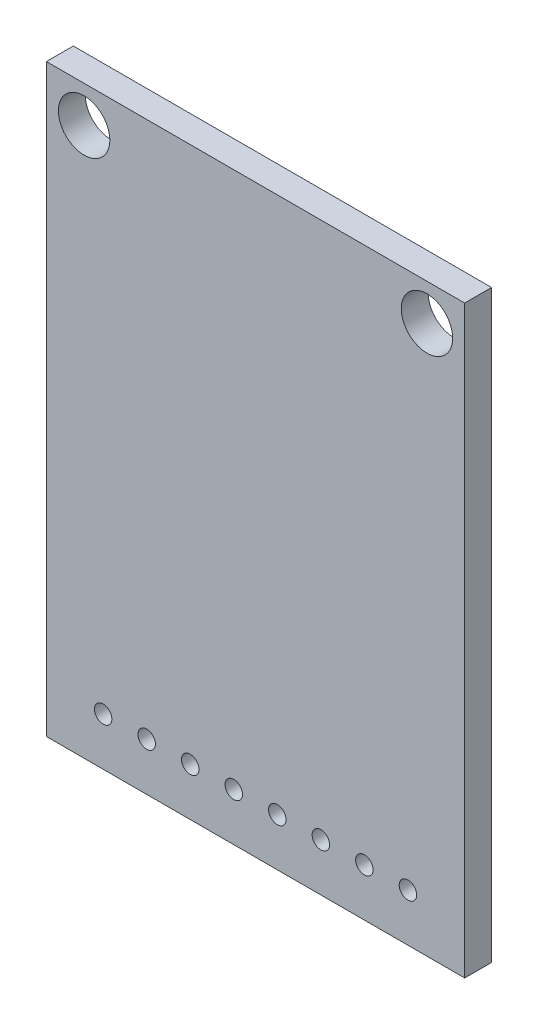
ISO-10303-21;
HEADER;
FILE_DESCRIPTION(('STEP AP214'),'2;1');
FILE_NAME('part.step','',(''),(''),'','','');
FILE_SCHEMA(('AUTOMOTIVE_DESIGN { 1 0 10303 214 1 1 1 1 }'));
ENDSEC;
DATA;
#1=APPLICATION_CONTEXT('core data for automotive mechanical design processes');
#2=APPLICATION_PROTOCOL_DEFINITION('international standard','automotive_design',2000,#1);
#3=PRODUCT_CONTEXT('',#1,'mechanical');
#4=PRODUCT('Part','Part','',(#3));
#5=PRODUCT_RELATED_PRODUCT_CATEGORY('part','',(#4));
#6=PRODUCT_DEFINITION_FORMATION('','',#4);
#7=PRODUCT_DEFINITION_CONTEXT('part definition',#1,'design');
#8=PRODUCT_DEFINITION('design','',#6,#7);
#9=PRODUCT_DEFINITION_SHAPE('','',#8);
#10=(LENGTH_UNIT() NAMED_UNIT(*) SI_UNIT(.MILLI.,.METRE.));
#11=(NAMED_UNIT(*) PLANE_ANGLE_UNIT() SI_UNIT($,.RADIAN.));
#12=(NAMED_UNIT(*) SI_UNIT($,.STERADIAN.) SOLID_ANGLE_UNIT());
#13=UNCERTAINTY_MEASURE_WITH_UNIT(LENGTH_MEASURE(1.E-05),#10,'distance_accuracy_value','');
#14=(GEOMETRIC_REPRESENTATION_CONTEXT(3) GLOBAL_UNCERTAINTY_ASSIGNED_CONTEXT((#13)) GLOBAL_UNIT_ASSIGNED_CONTEXT((#10,
#11,#12)) REPRESENTATION_CONTEXT('',''));
#15=CARTESIAN_POINT('',(0.,0.,0.));
#16=DIRECTION('',(0.,0.,1.));
#17=DIRECTION('',(1.,0.,0.));
#18=AXIS2_PLACEMENT_3D('',#15,#16,#17);
#19=CARTESIAN_POINT('',(0.,0.,1.57));
#20=DIRECTION('',(0.,0.,1.));
#21=DIRECTION('',(1.,0.,0.));
#22=AXIS2_PLACEMENT_3D('',#19,#20,#21);
#23=PLANE('',#22);
#24=CARTESIAN_POINT('',(6.35,-14.26,1.57));
#25=DIRECTION('',(0.,0.,1.));
#26=DIRECTION('',(1.,0.,0.));
#27=AXIS2_PLACEMENT_3D('',#24,#25,#26);
#28=CIRCLE('',#27,0.51);
#29=CARTESIAN_POINT('',(6.86,-14.26,1.57));
#30=VERTEX_POINT('',#29);
#31=EDGE_CURVE('E190',#30,#30,#28,.T.);
#32=ORIENTED_EDGE('',*,*,#31,.F.);
#33=EDGE_LOOP('',(#32));
#34=FACE_BOUND('',#33,.T.);
#35=CARTESIAN_POINT('',(1.27,-14.26,1.57));
#36=DIRECTION('',(0.,0.,1.));
#37=DIRECTION('',(1.,0.,0.));
#38=AXIS2_PLACEMENT_3D('',#35,#36,#37);
#39=CIRCLE('',#38,0.51);
#40=CARTESIAN_POINT('',(1.78,-14.26,1.57));
#41=VERTEX_POINT('',#40);
#42=EDGE_CURVE('E174',#41,#41,#39,.T.);
#43=ORIENTED_EDGE('',*,*,#42,.F.);
#44=EDGE_LOOP('',(#43));
#45=FACE_BOUND('',#44,.T.);
#46=CARTESIAN_POINT('',(-3.81,-14.26,1.57));
#47=DIRECTION('',(0.,0.,1.));
#48=DIRECTION('',(1.,0.,0.));
#49=AXIS2_PLACEMENT_3D('',#46,#47,#48);
#50=CIRCLE('',#49,0.51);
#51=CARTESIAN_POINT('',(-3.3,-14.26,1.57));
#52=VERTEX_POINT('',#51);
#53=EDGE_CURVE('E158',#52,#52,#50,.T.);
#54=ORIENTED_EDGE('',*,*,#53,.F.);
#55=EDGE_LOOP('',(#54));
#56=FACE_BOUND('',#55,.T.);
#57=CARTESIAN_POINT('',(-8.89,-14.26,1.57));
#58=DIRECTION('',(0.,0.,1.));
#59=DIRECTION('',(1.,0.,0.));
#60=AXIS2_PLACEMENT_3D('',#57,#58,#59);
#61=CIRCLE('',#60,0.510000000000001);
#62=CARTESIAN_POINT('',(-8.38,-14.26,1.57));
#63=VERTEX_POINT('',#62);
#64=EDGE_CURVE('E142',#63,#63,#61,.T.);
#65=ORIENTED_EDGE('',*,*,#64,.F.);
#66=EDGE_LOOP('',(#65));
#67=FACE_BOUND('',#66,.T.);
#68=CARTESIAN_POINT('',(-10.,14.92,1.57));
#69=DIRECTION('',(0.,0.,1.));
#70=DIRECTION('',(1.,0.,0.));
#71=AXIS2_PLACEMENT_3D('',#68,#69,#70);
#72=CIRCLE('',#71,1.5);
#73=CARTESIAN_POINT('',(-8.5,14.92,1.57));
#74=VERTEX_POINT('',#73);
#75=EDGE_CURVE('E112',#74,#74,#72,.T.);
#76=ORIENTED_EDGE('',*,*,#75,.F.);
#77=EDGE_LOOP('',(#76));
#78=FACE_BOUND('',#77,.T.);
#79=DIRECTION('',(0.,1.,0.));
#80=VECTOR('',#79,1.);
#81=CARTESIAN_POINT('',(12.2,17.05,1.57));
#82=LINE('',#81,#80);
#83=CARTESIAN_POINT('',(12.2,-17.05,1.57));
#84=VERTEX_POINT('',#83);
#85=CARTESIAN_POINT('',(12.2,17.05,1.57));
#86=VERTEX_POINT('',#85);
#87=EDGE_CURVE('E92',#84,#86,#82,.T.);
#88=ORIENTED_EDGE('',*,*,#87,.T.);
#89=DIRECTION('',(-1.,0.,0.));
#90=VECTOR('',#89,1.);
#91=CARTESIAN_POINT('',(-12.2,17.05,1.57));
#92=LINE('',#91,#90);
#93=CARTESIAN_POINT('',(-12.2,17.05,1.57));
#94=VERTEX_POINT('',#93);
#95=EDGE_CURVE('E87',#86,#94,#92,.T.);
#96=ORIENTED_EDGE('',*,*,#95,.T.);
#97=DIRECTION('',(0.,-1.,0.));
#98=VECTOR('',#97,1.);
#99=CARTESIAN_POINT('',(-12.2,17.05,1.57));
#100=LINE('',#99,#98);
#101=CARTESIAN_POINT('',(-12.2,-17.05,1.57));
#102=VERTEX_POINT('',#101);
#103=EDGE_CURVE('E90',#94,#102,#100,.T.);
#104=ORIENTED_EDGE('',*,*,#103,.T.);
#105=DIRECTION('',(1.,0.,0.));
#106=VECTOR('',#105,1.);
#107=CARTESIAN_POINT('',(-12.2,-17.05,1.57));
#108=LINE('',#107,#106);
#109=EDGE_CURVE('E57',#102,#84,#108,.T.);
#110=ORIENTED_EDGE('',*,*,#109,.T.);
#111=EDGE_LOOP('',(#88,#96,#104,#110));
#112=FACE_BOUND('',#111,.T.);
#113=CARTESIAN_POINT('',(10.,14.92,1.57));
#114=DIRECTION('',(0.,0.,1.));
#115=DIRECTION('',(1.,0.,0.));
#116=AXIS2_PLACEMENT_3D('',#113,#114,#115);
#117=CIRCLE('',#116,1.5);
#118=CARTESIAN_POINT('',(11.5,14.92,1.57));
#119=VERTEX_POINT('',#118);
#120=EDGE_CURVE('E134',#119,#119,#117,.T.);
#121=ORIENTED_EDGE('',*,*,#120,.F.);
#122=EDGE_LOOP('',(#121));
#123=FACE_BOUND('',#122,.T.);
#124=CARTESIAN_POINT('',(-6.35,-14.26,1.57));
#125=DIRECTION('',(0.,0.,1.));
#126=DIRECTION('',(1.,0.,0.));
#127=AXIS2_PLACEMENT_3D('',#124,#125,#126);
#128=CIRCLE('',#127,0.509999999999999);
#129=CARTESIAN_POINT('',(-5.84,-14.26,1.57));
#130=VERTEX_POINT('',#129);
#131=EDGE_CURVE('E150',#130,#130,#128,.T.);
#132=ORIENTED_EDGE('',*,*,#131,.F.);
#133=EDGE_LOOP('',(#132));
#134=FACE_BOUND('',#133,.T.);
#135=CARTESIAN_POINT('',(-1.27,-14.26,1.57));
#136=DIRECTION('',(0.,0.,1.));
#137=DIRECTION('',(1.,0.,0.));
#138=AXIS2_PLACEMENT_3D('',#135,#136,#137);
#139=CIRCLE('',#138,0.510000000000001);
#140=CARTESIAN_POINT('',(-0.76,-14.26,1.57));
#141=VERTEX_POINT('',#140);
#142=EDGE_CURVE('E166',#141,#141,#139,.T.);
#143=ORIENTED_EDGE('',*,*,#142,.F.);
#144=EDGE_LOOP('',(#143));
#145=FACE_BOUND('',#144,.T.);
#146=CARTESIAN_POINT('',(3.81,-14.26,1.57));
#147=DIRECTION('',(0.,0.,1.));
#148=DIRECTION('',(1.,0.,0.));
#149=AXIS2_PLACEMENT_3D('',#146,#147,#148);
#150=CIRCLE('',#149,0.51);
#151=CARTESIAN_POINT('',(4.32,-14.26,1.57));
#152=VERTEX_POINT('',#151);
#153=EDGE_CURVE('E182',#152,#152,#150,.T.);
#154=ORIENTED_EDGE('',*,*,#153,.F.);
#155=EDGE_LOOP('',(#154));
#156=FACE_BOUND('',#155,.T.);
#157=CARTESIAN_POINT('',(8.89,-14.26,1.57));
#158=DIRECTION('',(0.,0.,1.));
#159=DIRECTION('',(1.,0.,0.));
#160=AXIS2_PLACEMENT_3D('',#157,#158,#159);
#161=CIRCLE('',#160,0.510000000000001);
#162=CARTESIAN_POINT('',(9.4,-14.26,1.57));
#163=VERTEX_POINT('',#162);
#164=EDGE_CURVE('E198',#163,#163,#161,.T.);
#165=ORIENTED_EDGE('',*,*,#164,.F.);
#166=EDGE_LOOP('',(#165));
#167=FACE_BOUND('',#166,.T.);
#168=ADVANCED_FACE('F39',(#34,#45,#56,#67,#78,#112,#123,#134,#145,#156,#167),#23,.T.);
#169=CARTESIAN_POINT('',(0.,0.,0.));
#170=DIRECTION('',(0.,0.,1.));
#171=DIRECTION('',(1.,0.,0.));
#172=AXIS2_PLACEMENT_3D('',#169,#170,#171);
#173=PLANE('',#172);
#174=DIRECTION('',(0.,1.,0.));
#175=VECTOR('',#174,1.);
#176=CARTESIAN_POINT('',(12.2,17.05,0.));
#177=LINE('',#176,#175);
#178=CARTESIAN_POINT('',(12.2,-17.05,0.));
#179=VERTEX_POINT('',#178);
#180=CARTESIAN_POINT('',(12.2,17.05,0.));
#181=VERTEX_POINT('',#180);
#182=EDGE_CURVE('E108',#179,#181,#177,.T.);
#183=ORIENTED_EDGE('',*,*,#182,.F.);
#184=DIRECTION('',(1.,0.,0.));
#185=VECTOR('',#184,1.);
#186=CARTESIAN_POINT('',(-12.2,-17.05,0.));
#187=LINE('',#186,#185);
#188=CARTESIAN_POINT('',(-12.2,-17.05,0.));
#189=VERTEX_POINT('',#188);
#190=EDGE_CURVE('E80',#189,#179,#187,.T.);
#191=ORIENTED_EDGE('',*,*,#190,.F.);
#192=DIRECTION('',(0.,-1.,0.));
#193=VECTOR('',#192,1.);
#194=CARTESIAN_POINT('',(-12.2,17.05,0.));
#195=LINE('',#194,#193);
#196=CARTESIAN_POINT('',(-12.2,17.05,0.));
#197=VERTEX_POINT('',#196);
#198=EDGE_CURVE('E74',#197,#189,#195,.T.);
#199=ORIENTED_EDGE('',*,*,#198,.F.);
#200=DIRECTION('',(-1.,0.,0.));
#201=VECTOR('',#200,1.);
#202=CARTESIAN_POINT('',(-12.2,17.05,0.));
#203=LINE('',#202,#201);
#204=EDGE_CURVE('E97',#181,#197,#203,.T.);
#205=ORIENTED_EDGE('',*,*,#204,.F.);
#206=EDGE_LOOP('',(#183,#191,#199,#205));
#207=FACE_BOUND('',#206,.T.);
#208=CARTESIAN_POINT('',(-10.,14.92,0.));
#209=DIRECTION('',(0.,0.,1.));
#210=DIRECTION('',(1.,0.,0.));
#211=AXIS2_PLACEMENT_3D('',#208,#209,#210);
#212=CIRCLE('',#211,1.5);
#213=CARTESIAN_POINT('',(-8.5,14.92,0.));
#214=VERTEX_POINT('',#213);
#215=EDGE_CURVE('E130',#214,#214,#212,.T.);
#216=ORIENTED_EDGE('',*,*,#215,.T.);
#217=EDGE_LOOP('',(#216));
#218=FACE_BOUND('',#217,.T.);
#219=CARTESIAN_POINT('',(10.,14.92,0.));
#220=DIRECTION('',(0.,0.,1.));
#221=DIRECTION('',(1.,0.,0.));
#222=AXIS2_PLACEMENT_3D('',#219,#220,#221);
#223=CIRCLE('',#222,1.5);
#224=CARTESIAN_POINT('',(11.5,14.92,0.));
#225=VERTEX_POINT('',#224);
#226=EDGE_CURVE('E138',#225,#225,#223,.T.);
#227=ORIENTED_EDGE('',*,*,#226,.T.);
#228=EDGE_LOOP('',(#227));
#229=FACE_BOUND('',#228,.T.);
#230=CARTESIAN_POINT('',(-8.89,-14.26,0.));
#231=DIRECTION('',(0.,0.,1.));
#232=DIRECTION('',(1.,0.,0.));
#233=AXIS2_PLACEMENT_3D('',#230,#231,#232);
#234=CIRCLE('',#233,0.510000000000001);
#235=CARTESIAN_POINT('',(-8.38,-14.26,0.));
#236=VERTEX_POINT('',#235);
#237=EDGE_CURVE('E146',#236,#236,#234,.T.);
#238=ORIENTED_EDGE('',*,*,#237,.T.);
#239=EDGE_LOOP('',(#238));
#240=FACE_BOUND('',#239,.T.);
#241=CARTESIAN_POINT('',(-6.35,-14.26,0.));
#242=DIRECTION('',(0.,0.,1.));
#243=DIRECTION('',(1.,0.,0.));
#244=AXIS2_PLACEMENT_3D('',#241,#242,#243);
#245=CIRCLE('',#244,0.509999999999999);
#246=CARTESIAN_POINT('',(-5.84,-14.26,0.));
#247=VERTEX_POINT('',#246);
#248=EDGE_CURVE('E154',#247,#247,#245,.T.);
#249=ORIENTED_EDGE('',*,*,#248,.T.);
#250=EDGE_LOOP('',(#249));
#251=FACE_BOUND('',#250,.T.);
#252=CARTESIAN_POINT('',(-3.81,-14.26,0.));
#253=DIRECTION('',(0.,0.,1.));
#254=DIRECTION('',(1.,0.,0.));
#255=AXIS2_PLACEMENT_3D('',#252,#253,#254);
#256=CIRCLE('',#255,0.51);
#257=CARTESIAN_POINT('',(-3.3,-14.26,0.));
#258=VERTEX_POINT('',#257);
#259=EDGE_CURVE('E162',#258,#258,#256,.T.);
#260=ORIENTED_EDGE('',*,*,#259,.T.);
#261=EDGE_LOOP('',(#260));
#262=FACE_BOUND('',#261,.T.);
#263=CARTESIAN_POINT('',(-1.27,-14.26,0.));
#264=DIRECTION('',(0.,0.,1.));
#265=DIRECTION('',(1.,0.,0.));
#266=AXIS2_PLACEMENT_3D('',#263,#264,#265);
#267=CIRCLE('',#266,0.510000000000001);
#268=CARTESIAN_POINT('',(-0.76,-14.26,0.));
#269=VERTEX_POINT('',#268);
#270=EDGE_CURVE('E170',#269,#269,#267,.T.);
#271=ORIENTED_EDGE('',*,*,#270,.T.);
#272=EDGE_LOOP('',(#271));
#273=FACE_BOUND('',#272,.T.);
#274=CARTESIAN_POINT('',(1.27,-14.26,0.));
#275=DIRECTION('',(0.,0.,1.));
#276=DIRECTION('',(1.,0.,0.));
#277=AXIS2_PLACEMENT_3D('',#274,#275,#276);
#278=CIRCLE('',#277,0.51);
#279=CARTESIAN_POINT('',(1.78,-14.26,0.));
#280=VERTEX_POINT('',#279);
#281=EDGE_CURVE('E178',#280,#280,#278,.T.);
#282=ORIENTED_EDGE('',*,*,#281,.T.);
#283=EDGE_LOOP('',(#282));
#284=FACE_BOUND('',#283,.T.);
#285=CARTESIAN_POINT('',(3.81,-14.26,0.));
#286=DIRECTION('',(0.,0.,1.));
#287=DIRECTION('',(1.,0.,0.));
#288=AXIS2_PLACEMENT_3D('',#285,#286,#287);
#289=CIRCLE('',#288,0.51);
#290=CARTESIAN_POINT('',(4.32,-14.26,0.));
#291=VERTEX_POINT('',#290);
#292=EDGE_CURVE('E186',#291,#291,#289,.T.);
#293=ORIENTED_EDGE('',*,*,#292,.T.);
#294=EDGE_LOOP('',(#293));
#295=FACE_BOUND('',#294,.T.);
#296=CARTESIAN_POINT('',(6.35,-14.26,0.));
#297=DIRECTION('',(0.,0.,1.));
#298=DIRECTION('',(1.,0.,0.));
#299=AXIS2_PLACEMENT_3D('',#296,#297,#298);
#300=CIRCLE('',#299,0.51);
#301=CARTESIAN_POINT('',(6.86,-14.26,0.));
#302=VERTEX_POINT('',#301);
#303=EDGE_CURVE('E194',#302,#302,#300,.T.);
#304=ORIENTED_EDGE('',*,*,#303,.T.);
#305=EDGE_LOOP('',(#304));
#306=FACE_BOUND('',#305,.T.);
#307=CARTESIAN_POINT('',(8.89,-14.26,0.));
#308=DIRECTION('',(0.,0.,1.));
#309=DIRECTION('',(1.,0.,0.));
#310=AXIS2_PLACEMENT_3D('',#307,#308,#309);
#311=CIRCLE('',#310,0.510000000000001);
#312=CARTESIAN_POINT('',(9.4,-14.26,0.));
#313=VERTEX_POINT('',#312);
#314=EDGE_CURVE('E202',#313,#313,#311,.T.);
#315=ORIENTED_EDGE('',*,*,#314,.T.);
#316=EDGE_LOOP('',(#315));
#317=FACE_BOUND('',#316,.T.);
#318=ADVANCED_FACE('F125',(#207,#218,#229,#240,#251,#262,#273,#284,#295,#306,#317),#173,.F.);
#319=CARTESIAN_POINT('',(12.2,17.05,1.57));
#320=DIRECTION('',(-1.,0.,0.));
#321=DIRECTION('',(0.,-1.,0.));
#322=AXIS2_PLACEMENT_3D('',#319,#320,#321);
#323=PLANE('',#322);
#324=ORIENTED_EDGE('',*,*,#182,.T.);
#325=DIRECTION('',(0.,0.,-1.));
#326=VECTOR('',#325,1.);
#327=CARTESIAN_POINT('',(12.2,17.05,1.57));
#328=LINE('',#327,#326);
#329=EDGE_CURVE('E11',#86,#181,#328,.T.);
#330=ORIENTED_EDGE('',*,*,#329,.F.);
#331=ORIENTED_EDGE('',*,*,#87,.F.);
#332=DIRECTION('',(0.,0.,-1.));
#333=VECTOR('',#332,1.);
#334=CARTESIAN_POINT('',(12.2,-17.05,1.57));
#335=LINE('',#334,#333);
#336=EDGE_CURVE('E104',#84,#179,#335,.T.);
#337=ORIENTED_EDGE('',*,*,#336,.T.);
#338=EDGE_LOOP('',(#324,#330,#331,#337));
#339=FACE_BOUND('',#338,.T.);
#340=ADVANCED_FACE('F41',(#339),#323,.F.);
#341=CARTESIAN_POINT('',(-12.2,17.05,1.57));
#342=DIRECTION('',(0.,-1.,0.));
#343=DIRECTION('',(0.,0.,-1.));
#344=AXIS2_PLACEMENT_3D('',#341,#342,#343);
#345=PLANE('',#344);
#346=ORIENTED_EDGE('',*,*,#204,.T.);
#347=DIRECTION('',(0.,0.,-1.));
#348=VECTOR('',#347,1.);
#349=CARTESIAN_POINT('',(-12.2,17.05,1.57));
#350=LINE('',#349,#348);
#351=EDGE_CURVE('E49',#94,#197,#350,.T.);
#352=ORIENTED_EDGE('',*,*,#351,.F.);
#353=ORIENTED_EDGE('',*,*,#95,.F.);
#354=ORIENTED_EDGE('',*,*,#329,.T.);
#355=EDGE_LOOP('',(#346,#352,#353,#354));
#356=FACE_BOUND('',#355,.T.);
#357=ADVANCED_FACE('F96',(#356),#345,.F.);
#358=CARTESIAN_POINT('',(-12.2,17.05,1.57));
#359=DIRECTION('',(1.,0.,0.));
#360=DIRECTION('',(0.,1.,0.));
#361=AXIS2_PLACEMENT_3D('',#358,#359,#360);
#362=PLANE('',#361);
#363=ORIENTED_EDGE('',*,*,#198,.T.);
#364=DIRECTION('',(0.,0.,-1.));
#365=VECTOR('',#364,1.);
#366=CARTESIAN_POINT('',(-12.2,-17.05,1.57));
#367=LINE('',#366,#365);
#368=EDGE_CURVE('E99',#102,#189,#367,.T.);
#369=ORIENTED_EDGE('',*,*,#368,.F.);
#370=ORIENTED_EDGE('',*,*,#103,.F.);
#371=ORIENTED_EDGE('',*,*,#351,.T.);
#372=EDGE_LOOP('',(#363,#369,#370,#371));
#373=FACE_BOUND('',#372,.T.);
#374=ADVANCED_FACE('F100',(#373),#362,.F.);
#375=CARTESIAN_POINT('',(-12.2,-17.05,1.57));
#376=DIRECTION('',(0.,1.,0.));
#377=DIRECTION('',(0.,0.,1.));
#378=AXIS2_PLACEMENT_3D('',#375,#376,#377);
#379=PLANE('',#378);
#380=ORIENTED_EDGE('',*,*,#190,.T.);
#381=ORIENTED_EDGE('',*,*,#336,.F.);
#382=ORIENTED_EDGE('',*,*,#109,.F.);
#383=ORIENTED_EDGE('',*,*,#368,.T.);
#384=EDGE_LOOP('',(#380,#381,#382,#383));
#385=FACE_BOUND('',#384,.T.);
#386=ADVANCED_FACE('F122',(#385),#379,.F.);
#387=CARTESIAN_POINT('',(-10.,14.92,1.57));
#388=DIRECTION('',(0.,0.,-1.));
#389=DIRECTION('',(-1.,0.,0.));
#390=AXIS2_PLACEMENT_3D('',#387,#388,#389);
#391=CYLINDRICAL_SURFACE('',#390,1.5);
#392=ORIENTED_EDGE('',*,*,#75,.T.);
#393=EDGE_LOOP('',(#392));
#394=FACE_BOUND('',#393,.T.);
#395=ORIENTED_EDGE('',*,*,#215,.F.);
#396=EDGE_LOOP('',(#395));
#397=FACE_BOUND('',#396,.T.);
#398=ADVANCED_FACE('F223',(#394,#397),#391,.F.);
#399=CARTESIAN_POINT('',(10.,14.92,1.57));
#400=DIRECTION('',(0.,0.,-1.));
#401=DIRECTION('',(-1.,0.,0.));
#402=AXIS2_PLACEMENT_3D('',#399,#400,#401);
#403=CYLINDRICAL_SURFACE('',#402,1.5);
#404=ORIENTED_EDGE('',*,*,#120,.T.);
#405=EDGE_LOOP('',(#404));
#406=FACE_BOUND('',#405,.T.);
#407=ORIENTED_EDGE('',*,*,#226,.F.);
#408=EDGE_LOOP('',(#407));
#409=FACE_BOUND('',#408,.T.);
#410=ADVANCED_FACE('F269',(#406,#409),#403,.F.);
#411=CARTESIAN_POINT('',(-8.89,-14.26,1.57));
#412=DIRECTION('',(0.,0.,-1.));
#413=DIRECTION('',(-1.,0.,0.));
#414=AXIS2_PLACEMENT_3D('',#411,#412,#413);
#415=CYLINDRICAL_SURFACE('',#414,0.510000000000001);
#416=ORIENTED_EDGE('',*,*,#64,.T.);
#417=EDGE_LOOP('',(#416));
#418=FACE_BOUND('',#417,.T.);
#419=ORIENTED_EDGE('',*,*,#237,.F.);
#420=EDGE_LOOP('',(#419));
#421=FACE_BOUND('',#420,.T.);
#422=ADVANCED_FACE('F277',(#418,#421),#415,.F.);
#423=CARTESIAN_POINT('',(-6.35,-14.26,1.57));
#424=DIRECTION('',(0.,0.,-1.));
#425=DIRECTION('',(-1.,0.,0.));
#426=AXIS2_PLACEMENT_3D('',#423,#424,#425);
#427=CYLINDRICAL_SURFACE('',#426,0.509999999999999);
#428=ORIENTED_EDGE('',*,*,#131,.T.);
#429=EDGE_LOOP('',(#428));
#430=FACE_BOUND('',#429,.T.);
#431=ORIENTED_EDGE('',*,*,#248,.F.);
#432=EDGE_LOOP('',(#431));
#433=FACE_BOUND('',#432,.T.);
#434=ADVANCED_FACE('F285',(#430,#433),#427,.F.);
#435=CARTESIAN_POINT('',(-3.81,-14.26,1.57));
#436=DIRECTION('',(0.,0.,-1.));
#437=DIRECTION('',(-1.,0.,0.));
#438=AXIS2_PLACEMENT_3D('',#435,#436,#437);
#439=CYLINDRICAL_SURFACE('',#438,0.51);
#440=ORIENTED_EDGE('',*,*,#53,.T.);
#441=EDGE_LOOP('',(#440));
#442=FACE_BOUND('',#441,.T.);
#443=ORIENTED_EDGE('',*,*,#259,.F.);
#444=EDGE_LOOP('',(#443));
#445=FACE_BOUND('',#444,.T.);
#446=ADVANCED_FACE('F294',(#442,#445),#439,.F.);
#447=CARTESIAN_POINT('',(-1.27,-14.26,1.57));
#448=DIRECTION('',(0.,0.,-1.));
#449=DIRECTION('',(-1.,0.,0.));
#450=AXIS2_PLACEMENT_3D('',#447,#448,#449);
#451=CYLINDRICAL_SURFACE('',#450,0.510000000000001);
#452=ORIENTED_EDGE('',*,*,#142,.T.);
#453=EDGE_LOOP('',(#452));
#454=FACE_BOUND('',#453,.T.);
#455=ORIENTED_EDGE('',*,*,#270,.F.);
#456=EDGE_LOOP('',(#455));
#457=FACE_BOUND('',#456,.T.);
#458=ADVANCED_FACE('F303',(#454,#457),#451,.F.);
#459=CARTESIAN_POINT('',(1.27,-14.26,1.57));
#460=DIRECTION('',(0.,0.,-1.));
#461=DIRECTION('',(-1.,0.,0.));
#462=AXIS2_PLACEMENT_3D('',#459,#460,#461);
#463=CYLINDRICAL_SURFACE('',#462,0.51);
#464=ORIENTED_EDGE('',*,*,#42,.T.);
#465=EDGE_LOOP('',(#464));
#466=FACE_BOUND('',#465,.T.);
#467=ORIENTED_EDGE('',*,*,#281,.F.);
#468=EDGE_LOOP('',(#467));
#469=FACE_BOUND('',#468,.T.);
#470=ADVANCED_FACE('F312',(#466,#469),#463,.F.);
#471=CARTESIAN_POINT('',(3.81,-14.26,1.57));
#472=DIRECTION('',(0.,0.,-1.));
#473=DIRECTION('',(-1.,0.,0.));
#474=AXIS2_PLACEMENT_3D('',#471,#472,#473);
#475=CYLINDRICAL_SURFACE('',#474,0.51);
#476=ORIENTED_EDGE('',*,*,#153,.T.);
#477=EDGE_LOOP('',(#476));
#478=FACE_BOUND('',#477,.T.);
#479=ORIENTED_EDGE('',*,*,#292,.F.);
#480=EDGE_LOOP('',(#479));
#481=FACE_BOUND('',#480,.T.);
#482=ADVANCED_FACE('F321',(#478,#481),#475,.F.);
#483=CARTESIAN_POINT('',(6.35,-14.26,1.57));
#484=DIRECTION('',(0.,0.,-1.));
#485=DIRECTION('',(-1.,0.,0.));
#486=AXIS2_PLACEMENT_3D('',#483,#484,#485);
#487=CYLINDRICAL_SURFACE('',#486,0.51);
#488=ORIENTED_EDGE('',*,*,#31,.T.);
#489=EDGE_LOOP('',(#488));
#490=FACE_BOUND('',#489,.T.);
#491=ORIENTED_EDGE('',*,*,#303,.F.);
#492=EDGE_LOOP('',(#491));
#493=FACE_BOUND('',#492,.T.);
#494=ADVANCED_FACE('F330',(#490,#493),#487,.F.);
#495=CARTESIAN_POINT('',(8.89,-14.26,1.57));
#496=DIRECTION('',(0.,0.,-1.));
#497=DIRECTION('',(-1.,0.,0.));
#498=AXIS2_PLACEMENT_3D('',#495,#496,#497);
#499=CYLINDRICAL_SURFACE('',#498,0.510000000000001);
#500=ORIENTED_EDGE('',*,*,#164,.T.);
#501=EDGE_LOOP('',(#500));
#502=FACE_BOUND('',#501,.T.);
#503=ORIENTED_EDGE('',*,*,#314,.F.);
#504=EDGE_LOOP('',(#503));
#505=FACE_BOUND('',#504,.T.);
#506=ADVANCED_FACE('F210',(#502,#505),#499,.F.);
#507=CLOSED_SHELL('',(#168,#318,#340,#357,#374,#386,#398,#410,#422,#434,#446,#458,#470,#482,
#494,#506));
#508=MANIFOLD_SOLID_BREP('B2',#507);
#509=ADVANCED_BREP_SHAPE_REPRESENTATION('',(#18,#508),#14);
#510=SHAPE_DEFINITION_REPRESENTATION(#9,#509);
ENDSEC;
END-ISO-10303-21;
